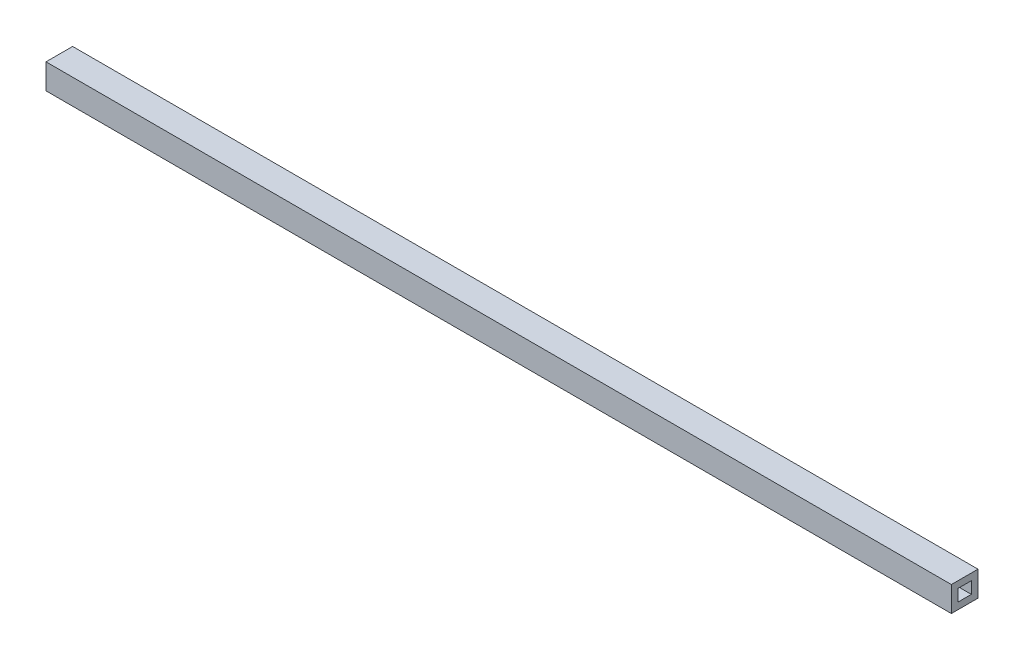
ISO-10303-21;
HEADER;
FILE_DESCRIPTION(('STEP AP214'),'2;1');
FILE_NAME('part.step','',(''),(''),'','','');
FILE_SCHEMA(('AUTOMOTIVE_DESIGN { 1 0 10303 214 1 1 1 1 }'));
ENDSEC;
DATA;
#1=APPLICATION_CONTEXT('core data for automotive mechanical design processes');
#2=APPLICATION_PROTOCOL_DEFINITION('international standard','automotive_design',2000,#1);
#3=PRODUCT_CONTEXT('',#1,'mechanical');
#4=PRODUCT('Part','Part','',(#3));
#5=PRODUCT_RELATED_PRODUCT_CATEGORY('part','',(#4));
#6=PRODUCT_DEFINITION_FORMATION('','',#4);
#7=PRODUCT_DEFINITION_CONTEXT('part definition',#1,'design');
#8=PRODUCT_DEFINITION('design','',#6,#7);
#9=PRODUCT_DEFINITION_SHAPE('','',#8);
#10=(LENGTH_UNIT() NAMED_UNIT(*) SI_UNIT(.MILLI.,.METRE.));
#11=(NAMED_UNIT(*) PLANE_ANGLE_UNIT() SI_UNIT($,.RADIAN.));
#12=(NAMED_UNIT(*) SI_UNIT($,.STERADIAN.) SOLID_ANGLE_UNIT());
#13=UNCERTAINTY_MEASURE_WITH_UNIT(LENGTH_MEASURE(1.E-05),#10,'distance_accuracy_value','');
#14=(GEOMETRIC_REPRESENTATION_CONTEXT(3) GLOBAL_UNCERTAINTY_ASSIGNED_CONTEXT((#13)) GLOBAL_UNIT_ASSIGNED_CONTEXT((#10,
#11,#12)) REPRESENTATION_CONTEXT('',''));
#15=CARTESIAN_POINT('',(0.,0.,0.));
#16=DIRECTION('',(0.,0.,1.));
#17=DIRECTION('',(1.,0.,0.));
#18=AXIS2_PLACEMENT_3D('',#15,#16,#17);
#19=CARTESIAN_POINT('',(431.8,11.9944444444445,12.7));
#20=DIRECTION('',(-1.,0.,0.));
#21=DIRECTION('',(0.,0.,1.));
#22=AXIS2_PLACEMENT_3D('',#19,#20,#21);
#23=PLANE('',#22);
#24=DIRECTION('',(0.,1.,0.));
#25=VECTOR('',#24,1.);
#26=CARTESIAN_POINT('',(431.8,-5.64444444444446,-6.35));
#27=LINE('',#26,#25);
#28=CARTESIAN_POINT('',(431.8,-5.64444444444446,-6.35));
#29=VERTEX_POINT('',#28);
#30=CARTESIAN_POINT('',(431.8,5.64444444444449,-6.35));
#31=VERTEX_POINT('',#30);
#32=EDGE_CURVE('E124',#29,#31,#27,.T.);
#33=ORIENTED_EDGE('',*,*,#32,.F.);
#34=DIRECTION('',(0.,0.,-1.));
#35=VECTOR('',#34,1.);
#36=CARTESIAN_POINT('',(431.8,-5.64444444444446,6.35));
#37=LINE('',#36,#35);
#38=CARTESIAN_POINT('',(431.8,-5.64444444444446,6.35));
#39=VERTEX_POINT('',#38);
#40=EDGE_CURVE('E47',#39,#29,#37,.T.);
#41=ORIENTED_EDGE('',*,*,#40,.F.);
#42=DIRECTION('',(0.,-1.,0.));
#43=VECTOR('',#42,1.);
#44=CARTESIAN_POINT('',(431.8,5.64444444444449,6.35));
#45=LINE('',#44,#43);
#46=CARTESIAN_POINT('',(431.8,5.64444444444449,6.35));
#47=VERTEX_POINT('',#46);
#48=EDGE_CURVE('E115',#47,#39,#45,.T.);
#49=ORIENTED_EDGE('',*,*,#48,.F.);
#50=DIRECTION('',(0.,0.,1.));
#51=VECTOR('',#50,1.);
#52=CARTESIAN_POINT('',(431.8,5.64444444444449,-6.35));
#53=LINE('',#52,#51);
#54=EDGE_CURVE('E118',#31,#47,#53,.T.);
#55=ORIENTED_EDGE('',*,*,#54,.F.);
#56=EDGE_LOOP('',(#33,#41,#49,#55));
#57=FACE_BOUND('',#56,.T.);
#58=DIRECTION('',(0.,1.,0.));
#59=VECTOR('',#58,1.);
#60=CARTESIAN_POINT('',(431.8,11.9944444444445,-12.7));
#61=LINE('',#60,#59);
#62=CARTESIAN_POINT('',(431.8,-11.9944444444445,-12.7));
#63=VERTEX_POINT('',#62);
#64=CARTESIAN_POINT('',(431.8,11.9944444444445,-12.7));
#65=VERTEX_POINT('',#64);
#66=EDGE_CURVE('E130',#63,#65,#61,.T.);
#67=ORIENTED_EDGE('',*,*,#66,.T.);
#68=DIRECTION('',(0.,0.,-1.));
#69=VECTOR('',#68,1.);
#70=CARTESIAN_POINT('',(431.8,11.9944444444445,12.7));
#71=LINE('',#70,#69);
#72=CARTESIAN_POINT('',(431.8,11.9944444444445,12.7));
#73=VERTEX_POINT('',#72);
#74=EDGE_CURVE('E11',#73,#65,#71,.T.);
#75=ORIENTED_EDGE('',*,*,#74,.F.);
#76=DIRECTION('',(0.,1.,0.));
#77=VECTOR('',#76,1.);
#78=CARTESIAN_POINT('',(431.8,11.9944444444445,12.7));
#79=LINE('',#78,#77);
#80=CARTESIAN_POINT('',(431.8,-11.9944444444445,12.7));
#81=VERTEX_POINT('',#80);
#82=EDGE_CURVE('E134',#81,#73,#79,.T.);
#83=ORIENTED_EDGE('',*,*,#82,.F.);
#84=DIRECTION('',(0.,0.,-1.));
#85=VECTOR('',#84,1.);
#86=CARTESIAN_POINT('',(431.8,-11.9944444444445,12.7));
#87=LINE('',#86,#85);
#88=EDGE_CURVE('E144',#81,#63,#87,.T.);
#89=ORIENTED_EDGE('',*,*,#88,.T.);
#90=EDGE_LOOP('',(#67,#75,#83,#89));
#91=FACE_BOUND('',#90,.T.);
#92=ADVANCED_FACE('F33',(#57,#91),#23,.F.);
#93=CARTESIAN_POINT('',(-431.8,11.9944444444445,12.7));
#94=DIRECTION('',(0.,-1.,0.));
#95=DIRECTION('',(1.,0.,0.));
#96=AXIS2_PLACEMENT_3D('',#93,#94,#95);
#97=PLANE('',#96);
#98=DIRECTION('',(-1.,0.,0.));
#99=VECTOR('',#98,1.);
#100=CARTESIAN_POINT('',(-431.8,11.9944444444445,-12.7));
#101=LINE('',#100,#99);
#102=CARTESIAN_POINT('',(-431.8,11.9944444444445,-12.7));
#103=VERTEX_POINT('',#102);
#104=EDGE_CURVE('E147',#65,#103,#101,.T.);
#105=ORIENTED_EDGE('',*,*,#104,.T.);
#106=DIRECTION('',(0.,0.,-1.));
#107=VECTOR('',#106,1.);
#108=CARTESIAN_POINT('',(-431.8,11.9944444444445,12.7));
#109=LINE('',#108,#107);
#110=CARTESIAN_POINT('',(-431.8,11.9944444444445,12.7));
#111=VERTEX_POINT('',#110);
#112=EDGE_CURVE('E40',#111,#103,#109,.T.);
#113=ORIENTED_EDGE('',*,*,#112,.F.);
#114=DIRECTION('',(-1.,0.,0.));
#115=VECTOR('',#114,1.);
#116=CARTESIAN_POINT('',(-431.8,11.9944444444445,12.7));
#117=LINE('',#116,#115);
#118=EDGE_CURVE('E137',#73,#111,#117,.T.);
#119=ORIENTED_EDGE('',*,*,#118,.F.);
#120=ORIENTED_EDGE('',*,*,#74,.T.);
#121=EDGE_LOOP('',(#105,#113,#119,#120));
#122=FACE_BOUND('',#121,.T.);
#123=ADVANCED_FACE('F175',(#122),#97,.F.);
#124=CARTESIAN_POINT('',(-431.8,11.9944444444445,12.7));
#125=DIRECTION('',(1.,0.,0.));
#126=DIRECTION('',(0.,0.,-1.));
#127=AXIS2_PLACEMENT_3D('',#124,#125,#126);
#128=PLANE('',#127);
#129=DIRECTION('',(0.,-1.,0.));
#130=VECTOR('',#129,1.);
#131=CARTESIAN_POINT('',(-431.8,5.64444444444449,6.35));
#132=LINE('',#131,#130);
#133=CARTESIAN_POINT('',(-431.8,5.64444444444449,6.35));
#134=VERTEX_POINT('',#133);
#135=CARTESIAN_POINT('',(-431.8,-5.64444444444446,6.35));
#136=VERTEX_POINT('',#135);
#137=EDGE_CURVE('E105',#134,#136,#132,.T.);
#138=ORIENTED_EDGE('',*,*,#137,.T.);
#139=DIRECTION('',(0.,0.,-1.));
#140=VECTOR('',#139,1.);
#141=CARTESIAN_POINT('',(-431.8,-5.64444444444446,6.35));
#142=LINE('',#141,#140);
#143=CARTESIAN_POINT('',(-431.8,-5.64444444444446,-6.35));
#144=VERTEX_POINT('',#143);
#145=EDGE_CURVE('E99',#136,#144,#142,.T.);
#146=ORIENTED_EDGE('',*,*,#145,.T.);
#147=DIRECTION('',(0.,1.,0.));
#148=VECTOR('',#147,1.);
#149=CARTESIAN_POINT('',(-431.8,-5.64444444444446,-6.35));
#150=LINE('',#149,#148);
#151=CARTESIAN_POINT('',(-431.8,5.64444444444449,-6.35));
#152=VERTEX_POINT('',#151);
#153=EDGE_CURVE('E108',#144,#152,#150,.T.);
#154=ORIENTED_EDGE('',*,*,#153,.T.);
#155=DIRECTION('',(0.,0.,1.));
#156=VECTOR('',#155,1.);
#157=CARTESIAN_POINT('',(-431.8,5.64444444444449,-6.35));
#158=LINE('',#157,#156);
#159=EDGE_CURVE('E55',#152,#134,#158,.T.);
#160=ORIENTED_EDGE('',*,*,#159,.T.);
#161=EDGE_LOOP('',(#138,#146,#154,#160));
#162=FACE_BOUND('',#161,.T.);
#163=DIRECTION('',(0.,-1.,0.));
#164=VECTOR('',#163,1.);
#165=CARTESIAN_POINT('',(-431.8,11.9944444444445,-12.7));
#166=LINE('',#165,#164);
#167=CARTESIAN_POINT('',(-431.8,-11.9944444444445,-12.7));
#168=VERTEX_POINT('',#167);
#169=EDGE_CURVE('E149',#103,#168,#166,.T.);
#170=ORIENTED_EDGE('',*,*,#169,.T.);
#171=DIRECTION('',(0.,0.,-1.));
#172=VECTOR('',#171,1.);
#173=CARTESIAN_POINT('',(-431.8,-11.9944444444445,12.7));
#174=LINE('',#173,#172);
#175=CARTESIAN_POINT('',(-431.8,-11.9944444444445,12.7));
#176=VERTEX_POINT('',#175);
#177=EDGE_CURVE('E154',#176,#168,#174,.T.);
#178=ORIENTED_EDGE('',*,*,#177,.F.);
#179=DIRECTION('',(0.,-1.,0.));
#180=VECTOR('',#179,1.);
#181=CARTESIAN_POINT('',(-431.8,11.9944444444445,12.7));
#182=LINE('',#181,#180);
#183=EDGE_CURVE('E140',#111,#176,#182,.T.);
#184=ORIENTED_EDGE('',*,*,#183,.F.);
#185=ORIENTED_EDGE('',*,*,#112,.T.);
#186=EDGE_LOOP('',(#170,#178,#184,#185));
#187=FACE_BOUND('',#186,.T.);
#188=ADVANCED_FACE('F112',(#162,#187),#128,.F.);
#189=CARTESIAN_POINT('',(-431.8,-11.9944444444445,12.7));
#190=DIRECTION('',(0.,1.,0.));
#191=DIRECTION('',(0.,0.,1.));
#192=AXIS2_PLACEMENT_3D('',#189,#190,#191);
#193=PLANE('',#192);
#194=DIRECTION('',(1.,0.,0.));
#195=VECTOR('',#194,1.);
#196=CARTESIAN_POINT('',(-431.8,-11.9944444444445,-12.7));
#197=LINE('',#196,#195);
#198=EDGE_CURVE('E138',#168,#63,#197,.T.);
#199=ORIENTED_EDGE('',*,*,#198,.T.);
#200=ORIENTED_EDGE('',*,*,#88,.F.);
#201=DIRECTION('',(1.,0.,0.));
#202=VECTOR('',#201,1.);
#203=CARTESIAN_POINT('',(-431.8,-11.9944444444445,12.7));
#204=LINE('',#203,#202);
#205=EDGE_CURVE('E142',#176,#81,#204,.T.);
#206=ORIENTED_EDGE('',*,*,#205,.F.);
#207=ORIENTED_EDGE('',*,*,#177,.T.);
#208=EDGE_LOOP('',(#199,#200,#206,#207));
#209=FACE_BOUND('',#208,.T.);
#210=ADVANCED_FACE('F168',(#209),#193,.F.);
#211=CARTESIAN_POINT('',(0.,0.,12.7));
#212=DIRECTION('',(0.,0.,1.));
#213=DIRECTION('',(1.,0.,0.));
#214=AXIS2_PLACEMENT_3D('',#211,#212,#213);
#215=PLANE('',#214);
#216=ORIENTED_EDGE('',*,*,#82,.T.);
#217=ORIENTED_EDGE('',*,*,#118,.T.);
#218=ORIENTED_EDGE('',*,*,#183,.T.);
#219=ORIENTED_EDGE('',*,*,#205,.T.);
#220=EDGE_LOOP('',(#216,#217,#218,#219));
#221=FACE_BOUND('',#220,.T.);
#222=ADVANCED_FACE('F174',(#221),#215,.T.);
#223=CARTESIAN_POINT('',(0.,0.,-12.7));
#224=DIRECTION('',(0.,0.,1.));
#225=DIRECTION('',(1.,0.,0.));
#226=AXIS2_PLACEMENT_3D('',#223,#224,#225);
#227=PLANE('',#226);
#228=ORIENTED_EDGE('',*,*,#66,.F.);
#229=ORIENTED_EDGE('',*,*,#198,.F.);
#230=ORIENTED_EDGE('',*,*,#169,.F.);
#231=ORIENTED_EDGE('',*,*,#104,.F.);
#232=EDGE_LOOP('',(#228,#229,#230,#231));
#233=FACE_BOUND('',#232,.T.);
#234=ADVANCED_FACE('F165',(#233),#227,.F.);
#235=CARTESIAN_POINT('',(-431.8,-5.64444444444446,6.35));
#236=DIRECTION('',(0.,-1.,0.));
#237=DIRECTION('',(0.,0.,-1.));
#238=AXIS2_PLACEMENT_3D('',#235,#236,#237);
#239=PLANE('',#238);
#240=ORIENTED_EDGE('',*,*,#40,.T.);
#241=DIRECTION('',(1.,0.,0.));
#242=VECTOR('',#241,1.);
#243=CARTESIAN_POINT('',(-431.8,-5.64444444444446,-6.35));
#244=LINE('',#243,#242);
#245=EDGE_CURVE('E95',#144,#29,#244,.T.);
#246=ORIENTED_EDGE('',*,*,#245,.F.);
#247=ORIENTED_EDGE('',*,*,#145,.F.);
#248=DIRECTION('',(1.,0.,0.));
#249=VECTOR('',#248,1.);
#250=CARTESIAN_POINT('',(-431.8,-5.64444444444446,6.35));
#251=LINE('',#250,#249);
#252=EDGE_CURVE('E128',#136,#39,#251,.T.);
#253=ORIENTED_EDGE('',*,*,#252,.T.);
#254=EDGE_LOOP('',(#240,#246,#247,#253));
#255=FACE_BOUND('',#254,.T.);
#256=ADVANCED_FACE('F97',(#255),#239,.F.);
#257=CARTESIAN_POINT('',(-431.8,5.64444444444449,6.35));
#258=DIRECTION('',(0.,0.,1.));
#259=DIRECTION('',(1.,0.,0.));
#260=AXIS2_PLACEMENT_3D('',#257,#258,#259);
#261=PLANE('',#260);
#262=ORIENTED_EDGE('',*,*,#48,.T.);
#263=ORIENTED_EDGE('',*,*,#252,.F.);
#264=ORIENTED_EDGE('',*,*,#137,.F.);
#265=DIRECTION('',(1.,0.,0.));
#266=VECTOR('',#265,1.);
#267=CARTESIAN_POINT('',(-431.8,5.64444444444449,6.35));
#268=LINE('',#267,#266);
#269=EDGE_CURVE('E131',#134,#47,#268,.T.);
#270=ORIENTED_EDGE('',*,*,#269,.T.);
#271=EDGE_LOOP('',(#262,#263,#264,#270));
#272=FACE_BOUND('',#271,.T.);
#273=ADVANCED_FACE('F192',(#272),#261,.F.);
#274=CARTESIAN_POINT('',(-431.8,5.64444444444449,-6.35));
#275=DIRECTION('',(0.,1.,0.));
#276=DIRECTION('',(0.,0.,1.));
#277=AXIS2_PLACEMENT_3D('',#274,#275,#276);
#278=PLANE('',#277);
#279=ORIENTED_EDGE('',*,*,#54,.T.);
#280=ORIENTED_EDGE('',*,*,#269,.F.);
#281=ORIENTED_EDGE('',*,*,#159,.F.);
#282=DIRECTION('',(1.,0.,0.));
#283=VECTOR('',#282,1.);
#284=CARTESIAN_POINT('',(-431.8,5.64444444444449,-6.35));
#285=LINE('',#284,#283);
#286=EDGE_CURVE('E104',#152,#31,#285,.T.);
#287=ORIENTED_EDGE('',*,*,#286,.T.);
#288=EDGE_LOOP('',(#279,#280,#281,#287));
#289=FACE_BOUND('',#288,.T.);
#290=ADVANCED_FACE('F195',(#289),#278,.F.);
#291=CARTESIAN_POINT('',(-431.8,-5.64444444444446,-6.35));
#292=DIRECTION('',(0.,0.,-1.));
#293=DIRECTION('',(-1.,0.,0.));
#294=AXIS2_PLACEMENT_3D('',#291,#292,#293);
#295=PLANE('',#294);
#296=ORIENTED_EDGE('',*,*,#32,.T.);
#297=ORIENTED_EDGE('',*,*,#286,.F.);
#298=ORIENTED_EDGE('',*,*,#153,.F.);
#299=ORIENTED_EDGE('',*,*,#245,.T.);
#300=EDGE_LOOP('',(#296,#297,#298,#299));
#301=FACE_BOUND('',#300,.T.);
#302=ADVANCED_FACE('F109',(#301),#295,.F.);
#303=CLOSED_SHELL('',(#92,#123,#188,#210,#222,#234,#256,#273,#290,#302));
#304=MANIFOLD_SOLID_BREP('B2',#303);
#305=ADVANCED_BREP_SHAPE_REPRESENTATION('',(#18,#304),#14);
#306=SHAPE_DEFINITION_REPRESENTATION(#9,#305);
ENDSEC;
END-ISO-10303-21;
